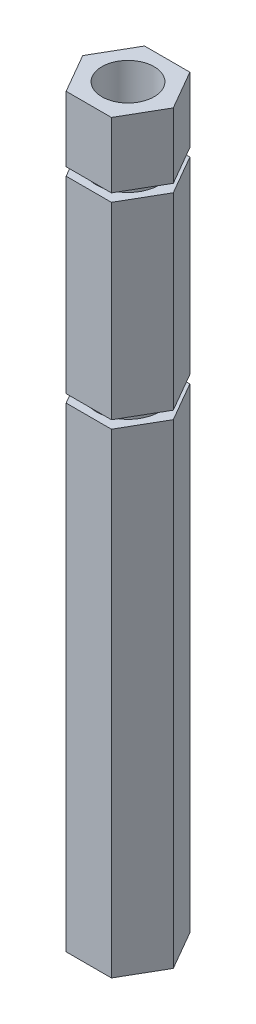
ISO-10303-21;
HEADER;
FILE_DESCRIPTION(('STEP AP214'),'2;1');
FILE_NAME('part.step','',(''),(''),'','','');
FILE_SCHEMA(('AUTOMOTIVE_DESIGN { 1 0 10303 214 1 1 1 1 }'));
ENDSEC;
DATA;
#1=APPLICATION_CONTEXT('core data for automotive mechanical design processes');
#2=APPLICATION_PROTOCOL_DEFINITION('international standard','automotive_design',2000,#1);
#3=PRODUCT_CONTEXT('',#1,'mechanical');
#4=PRODUCT('Part','Part','',(#3));
#5=PRODUCT_RELATED_PRODUCT_CATEGORY('part','',(#4));
#6=PRODUCT_DEFINITION_FORMATION('','',#4);
#7=PRODUCT_DEFINITION_CONTEXT('part definition',#1,'design');
#8=PRODUCT_DEFINITION('design','',#6,#7);
#9=PRODUCT_DEFINITION_SHAPE('','',#8);
#10=(LENGTH_UNIT() NAMED_UNIT(*) SI_UNIT(.MILLI.,.METRE.));
#11=(NAMED_UNIT(*) PLANE_ANGLE_UNIT() SI_UNIT($,.RADIAN.));
#12=(NAMED_UNIT(*) SI_UNIT($,.STERADIAN.) SOLID_ANGLE_UNIT());
#13=UNCERTAINTY_MEASURE_WITH_UNIT(LENGTH_MEASURE(1.E-05),#10,'distance_accuracy_value','');
#14=(GEOMETRIC_REPRESENTATION_CONTEXT(3) GLOBAL_UNCERTAINTY_ASSIGNED_CONTEXT((#13)) GLOBAL_UNIT_ASSIGNED_CONTEXT((#10,
#11,#12)) REPRESENTATION_CONTEXT('',''));
#15=CARTESIAN_POINT('',(0.,0.,0.));
#16=DIRECTION('',(0.,0.,1.));
#17=DIRECTION('',(1.,0.,0.));
#18=AXIS2_PLACEMENT_3D('',#15,#16,#17);
#19=CARTESIAN_POINT('',(0.,77.6732,0.));
#20=DIRECTION('',(0.,1.,0.));
#21=DIRECTION('',(0.,0.,1.));
#22=AXIS2_PLACEMENT_3D('',#19,#20,#21);
#23=PLANE('',#22);
#24=CARTESIAN_POINT('',(0.,77.6732,0.));
#25=DIRECTION('',(0.,1.,0.));
#26=DIRECTION('',(0.,0.,1.));
#27=AXIS2_PLACEMENT_3D('',#24,#25,#26);
#28=CIRCLE('',#27,3.16865);
#29=CARTESIAN_POINT('',(0.,77.6732,3.16865));
#30=VERTEX_POINT('',#29);
#31=EDGE_CURVE('E20',#30,#30,#28,.T.);
#32=ORIENTED_EDGE('',*,*,#31,.T.);
#33=EDGE_LOOP('',(#32));
#34=FACE_BOUND('',#33,.T.);
#35=ADVANCED_FACE('F17',(#34),#23,.T.);
#36=CARTESIAN_POINT('',(0.,77.6732,0.));
#37=DIRECTION('',(0.,1.,0.));
#38=DIRECTION('',(0.,0.,1.));
#39=AXIS2_PLACEMENT_3D('',#36,#37,#38);
#40=CYLINDRICAL_SURFACE('',#39,3.16865);
#41=CARTESIAN_POINT('',(0.,90.3732,0.));
#42=DIRECTION('',(0.,1.,0.));
#43=DIRECTION('',(0.,0.,1.));
#44=AXIS2_PLACEMENT_3D('',#41,#42,#43);
#45=CIRCLE('',#44,3.16865);
#46=CARTESIAN_POINT('',(0.,90.3732,3.16865));
#47=VERTEX_POINT('',#46);
#48=EDGE_CURVE('E154',#47,#47,#45,.F.);
#49=ORIENTED_EDGE('',*,*,#48,.F.);
#50=EDGE_LOOP('',(#49));
#51=FACE_BOUND('',#50,.T.);
#52=ORIENTED_EDGE('',*,*,#31,.F.);
#53=EDGE_LOOP('',(#52));
#54=FACE_BOUND('',#53,.T.);
#55=ADVANCED_FACE('F190',(#51,#54),#40,.F.);
#56=CARTESIAN_POINT('',(0.,90.3732,0.));
#57=DIRECTION('',(0.,1.,0.));
#58=DIRECTION('',(0.,0.,1.));
#59=AXIS2_PLACEMENT_3D('',#56,#57,#58);
#60=PLANE('',#59);
#61=DIRECTION('',(-0.500000000000007,0.,-0.866025403784435));
#62=VECTOR('',#61,1.);
#63=CARTESIAN_POINT('',(-5.49192896561248,90.3732,0.));
#64=LINE('',#63,#62);
#65=CARTESIAN_POINT('',(-5.49192896561248,90.3732,0.));
#66=VERTEX_POINT('',#65);
#67=CARTESIAN_POINT('',(-2.7459644828062,90.3732,4.75615000000003));
#68=VERTEX_POINT('',#67);
#69=EDGE_CURVE('E158',#66,#68,#64,.F.);
#70=ORIENTED_EDGE('',*,*,#69,.T.);
#71=DIRECTION('',(-1.,0.,0.));
#72=VECTOR('',#71,1.);
#73=CARTESIAN_POINT('',(-2.7459644828062,90.3732,4.75615000000003));
#74=LINE('',#73,#72);
#75=CARTESIAN_POINT('',(2.74596448280628,90.3732,4.75615));
#76=VERTEX_POINT('',#75);
#77=EDGE_CURVE('E139',#68,#76,#74,.F.);
#78=ORIENTED_EDGE('',*,*,#77,.T.);
#79=DIRECTION('',(-0.499999999999995,0.,0.866025403784442));
#80=VECTOR('',#79,1.);
#81=CARTESIAN_POINT('',(2.7459644828063,90.3732,4.75614999999997));
#82=LINE('',#81,#80);
#83=CARTESIAN_POINT('',(5.49192896561248,90.3732,0.));
#84=VERTEX_POINT('',#83);
#85=EDGE_CURVE('E145',#76,#84,#82,.F.);
#86=ORIENTED_EDGE('',*,*,#85,.T.);
#87=DIRECTION('',(0.500000000000001,0.,0.866025403784438));
#88=VECTOR('',#87,1.);
#89=CARTESIAN_POINT('',(5.49192896561248,90.3732,0.));
#90=LINE('',#89,#88);
#91=CARTESIAN_POINT('',(2.74596448280623,90.3732,-4.75615000000001));
#92=VERTEX_POINT('',#91);
#93=EDGE_CURVE('E486',#84,#92,#90,.F.);
#94=ORIENTED_EDGE('',*,*,#93,.T.);
#95=DIRECTION('',(1.,0.,0.));
#96=VECTOR('',#95,1.);
#97=CARTESIAN_POINT('',(2.74596448280623,90.3732,-4.75615000000001));
#98=LINE('',#97,#96);
#99=CARTESIAN_POINT('',(-2.74596448280626,90.3732,-4.75615));
#100=VERTEX_POINT('',#99);
#101=EDGE_CURVE('E479',#92,#100,#98,.F.);
#102=ORIENTED_EDGE('',*,*,#101,.T.);
#103=DIRECTION('',(0.499999999999995,0.,-0.866025403784442));
#104=VECTOR('',#103,1.);
#105=CARTESIAN_POINT('',(-2.74596448280626,90.3732,-4.75614999999999));
#106=LINE('',#105,#104);
#107=EDGE_CURVE('E473',#100,#66,#106,.F.);
#108=ORIENTED_EDGE('',*,*,#107,.T.);
#109=EDGE_LOOP('',(#70,#78,#86,#94,#102,#108));
#110=FACE_BOUND('',#109,.T.);
#111=ORIENTED_EDGE('',*,*,#48,.T.);
#112=EDGE_LOOP('',(#111));
#113=FACE_BOUND('',#112,.T.);
#114=ADVANCED_FACE('F161',(#110,#113),#60,.T.);
#115=CARTESIAN_POINT('',(2.7459644828063,90.3732,4.75614999999997));
#116=DIRECTION('',(-0.866025403784442,0.,-0.499999999999995));
#117=DIRECTION('',(-0.499999999999995,0.,0.866025403784442));
#118=AXIS2_PLACEMENT_3D('',#115,#116,#117);
#119=PLANE('',#118);
#120=DIRECTION('',(0.,1.,0.));
#121=VECTOR('',#120,1.);
#122=CARTESIAN_POINT('',(5.49192896561248,90.3732,0.));
#123=LINE('',#122,#121);
#124=CARTESIAN_POINT('',(5.49192896561248,82.4484,0.));
#125=VERTEX_POINT('',#124);
#126=EDGE_CURVE('E150',#125,#84,#123,.T.);
#127=ORIENTED_EDGE('',*,*,#126,.T.);
#128=ORIENTED_EDGE('',*,*,#85,.F.);
#129=DIRECTION('',(0.,1.,0.));
#130=VECTOR('',#129,1.);
#131=CARTESIAN_POINT('',(2.7459644828063,90.3732,4.75614999999997));
#132=LINE('',#131,#130);
#133=CARTESIAN_POINT('',(2.7459644828063,82.4484,4.75614999999997));
#134=VERTEX_POINT('',#133);
#135=EDGE_CURVE('E148',#76,#134,#132,.F.);
#136=ORIENTED_EDGE('',*,*,#135,.T.);
#137=DIRECTION('',(-0.499999999999995,0.,0.866025403784442));
#138=VECTOR('',#137,1.);
#139=CARTESIAN_POINT('',(5.49192896561248,82.4484,0.));
#140=LINE('',#139,#138);
#141=EDGE_CURVE('E491',#125,#134,#140,.T.);
#142=ORIENTED_EDGE('',*,*,#141,.F.);
#143=EDGE_LOOP('',(#127,#128,#136,#142));
#144=FACE_BOUND('',#143,.T.);
#145=ADVANCED_FACE('F146',(#144),#119,.F.);
#146=CARTESIAN_POINT('',(-2.7459644828062,90.3732,4.75615000000003));
#147=DIRECTION('',(0.,0.,-1.));
#148=DIRECTION('',(-1.,0.,0.));
#149=AXIS2_PLACEMENT_3D('',#146,#147,#148);
#150=PLANE('',#149);
#151=ORIENTED_EDGE('',*,*,#135,.F.);
#152=ORIENTED_EDGE('',*,*,#77,.F.);
#153=DIRECTION('',(0.,1.,0.));
#154=VECTOR('',#153,1.);
#155=CARTESIAN_POINT('',(-2.7459644828062,90.3732,4.75615000000003));
#156=LINE('',#155,#154);
#157=CARTESIAN_POINT('',(-2.7459644828062,82.4484,4.75615000000001));
#158=VERTEX_POINT('',#157);
#159=EDGE_CURVE('E469',#68,#158,#156,.F.);
#160=ORIENTED_EDGE('',*,*,#159,.T.);
#161=DIRECTION('',(1.,0.,0.));
#162=VECTOR('',#161,1.);
#163=CARTESIAN_POINT('',(3.8481,82.4484,4.75614999999997));
#164=LINE('',#163,#162);
#165=EDGE_CURVE('E157',#134,#158,#164,.F.);
#166=ORIENTED_EDGE('',*,*,#165,.F.);
#167=EDGE_LOOP('',(#151,#152,#160,#166));
#168=FACE_BOUND('',#167,.T.);
#169=ADVANCED_FACE('F156',(#168),#150,.F.);
#170=CARTESIAN_POINT('',(-5.49192896561248,90.3732,0.));
#171=DIRECTION('',(0.866025403784435,0.,-0.500000000000007));
#172=DIRECTION('',(-0.500000000000007,0.,-0.866025403784435));
#173=AXIS2_PLACEMENT_3D('',#170,#171,#172);
#174=PLANE('',#173);
#175=ORIENTED_EDGE('',*,*,#159,.F.);
#176=ORIENTED_EDGE('',*,*,#69,.F.);
#177=DIRECTION('',(0.,1.,0.));
#178=VECTOR('',#177,1.);
#179=CARTESIAN_POINT('',(-5.49192896561248,90.3732,0.));
#180=LINE('',#179,#178);
#181=CARTESIAN_POINT('',(-5.49192896561248,82.4484,0.));
#182=VERTEX_POINT('',#181);
#183=EDGE_CURVE('E475',#66,#182,#180,.F.);
#184=ORIENTED_EDGE('',*,*,#183,.T.);
#185=DIRECTION('',(-0.500000000000007,0.,-0.866025403784435));
#186=VECTOR('',#185,1.);
#187=CARTESIAN_POINT('',(-2.7459644828062,82.4484,4.75615000000003));
#188=LINE('',#187,#186);
#189=EDGE_CURVE('E472',#158,#182,#188,.T.);
#190=ORIENTED_EDGE('',*,*,#189,.F.);
#191=EDGE_LOOP('',(#175,#176,#184,#190));
#192=FACE_BOUND('',#191,.T.);
#193=ADVANCED_FACE('F289',(#192),#174,.F.);
#194=CARTESIAN_POINT('',(-2.74596448280626,90.3732,-4.75614999999999));
#195=DIRECTION('',(0.866025403784442,0.,0.499999999999995));
#196=DIRECTION('',(0.499999999999995,0.,-0.866025403784442));
#197=AXIS2_PLACEMENT_3D('',#194,#195,#196);
#198=PLANE('',#197);
#199=ORIENTED_EDGE('',*,*,#183,.F.);
#200=ORIENTED_EDGE('',*,*,#107,.F.);
#201=DIRECTION('',(0.,1.,0.));
#202=VECTOR('',#201,1.);
#203=CARTESIAN_POINT('',(-2.74596448280626,90.3732,-4.75614999999999));
#204=LINE('',#203,#202);
#205=CARTESIAN_POINT('',(-2.74596448280626,82.4484,-4.75614999999999));
#206=VERTEX_POINT('',#205);
#207=EDGE_CURVE('E482',#100,#206,#204,.F.);
#208=ORIENTED_EDGE('',*,*,#207,.T.);
#209=DIRECTION('',(0.499999999999995,0.,-0.866025403784441));
#210=VECTOR('',#209,1.);
#211=CARTESIAN_POINT('',(-5.49192896561248,82.4484,0.));
#212=LINE('',#211,#210);
#213=EDGE_CURVE('E495',#182,#206,#212,.T.);
#214=ORIENTED_EDGE('',*,*,#213,.F.);
#215=EDGE_LOOP('',(#199,#200,#208,#214));
#216=FACE_BOUND('',#215,.T.);
#217=ADVANCED_FACE('F285',(#216),#198,.F.);
#218=CARTESIAN_POINT('',(2.74596448280623,90.3732,-4.75615000000001));
#219=DIRECTION('',(0.,0.,1.));
#220=DIRECTION('',(1.,0.,0.));
#221=AXIS2_PLACEMENT_3D('',#218,#219,#220);
#222=PLANE('',#221);
#223=ORIENTED_EDGE('',*,*,#207,.F.);
#224=ORIENTED_EDGE('',*,*,#101,.F.);
#225=DIRECTION('',(0.,1.,0.));
#226=VECTOR('',#225,1.);
#227=CARTESIAN_POINT('',(2.74596448280623,90.3732,-4.75615000000001));
#228=LINE('',#227,#226);
#229=CARTESIAN_POINT('',(2.74596448280623,82.4484,-4.75615));
#230=VERTEX_POINT('',#229);
#231=EDGE_CURVE('E488',#92,#230,#228,.F.);
#232=ORIENTED_EDGE('',*,*,#231,.T.);
#233=DIRECTION('',(1.,0.,0.));
#234=VECTOR('',#233,1.);
#235=CARTESIAN_POINT('',(3.8481,82.4484,-4.75614999999999));
#236=LINE('',#235,#234);
#237=EDGE_CURVE('E497',#206,#230,#236,.T.);
#238=ORIENTED_EDGE('',*,*,#237,.F.);
#239=EDGE_LOOP('',(#223,#224,#232,#238));
#240=FACE_BOUND('',#239,.T.);
#241=ADVANCED_FACE('F281',(#240),#222,.F.);
#242=CARTESIAN_POINT('',(5.49192896561248,90.3732,0.));
#243=DIRECTION('',(-0.866025403784438,0.,0.500000000000001));
#244=DIRECTION('',(0.500000000000001,0.,0.866025403784438));
#245=AXIS2_PLACEMENT_3D('',#242,#243,#244);
#246=PLANE('',#245);
#247=ORIENTED_EDGE('',*,*,#231,.F.);
#248=ORIENTED_EDGE('',*,*,#93,.F.);
#249=ORIENTED_EDGE('',*,*,#126,.F.);
#250=DIRECTION('',(0.500000000000001,0.,0.866025403784438));
#251=VECTOR('',#250,1.);
#252=CARTESIAN_POINT('',(2.74596448280623,82.4484,-4.75615000000001));
#253=LINE('',#252,#251);
#254=EDGE_CURVE('E183',#230,#125,#253,.T.);
#255=ORIENTED_EDGE('',*,*,#254,.F.);
#256=EDGE_LOOP('',(#247,#248,#249,#255));
#257=FACE_BOUND('',#256,.T.);
#258=ADVANCED_FACE('F277',(#257),#246,.F.);
#259=CARTESIAN_POINT('',(3.8481,82.4484,0.));
#260=DIRECTION('',(0.,-1.,0.));
#261=DIRECTION('',(0.,0.,-1.));
#262=AXIS2_PLACEMENT_3D('',#259,#260,#261);
#263=PLANE('',#262);
#264=ORIENTED_EDGE('',*,*,#237,.T.);
#265=ORIENTED_EDGE('',*,*,#254,.T.);
#266=ORIENTED_EDGE('',*,*,#141,.T.);
#267=ORIENTED_EDGE('',*,*,#165,.T.);
#268=ORIENTED_EDGE('',*,*,#189,.T.);
#269=ORIENTED_EDGE('',*,*,#213,.T.);
#270=EDGE_LOOP('',(#264,#265,#266,#267,#268,#269));
#271=FACE_BOUND('',#270,.T.);
#272=CARTESIAN_POINT('',(0.,82.4484,0.));
#273=DIRECTION('',(0.,1.,0.));
#274=DIRECTION('',(0.,0.,1.));
#275=AXIS2_PLACEMENT_3D('',#272,#273,#274);
#276=CIRCLE('',#275,3.8481);
#277=CARTESIAN_POINT('',(0.,82.4484,3.8481));
#278=VERTEX_POINT('',#277);
#279=EDGE_CURVE('E181',#278,#278,#276,.F.);
#280=ORIENTED_EDGE('',*,*,#279,.F.);
#281=EDGE_LOOP('',(#280));
#282=FACE_BOUND('',#281,.T.);
#283=ADVANCED_FACE('F273',(#271,#282),#263,.T.);
#284=CARTESIAN_POINT('',(0.,88.5049982362318,0.));
#285=DIRECTION('',(0.,1.,0.));
#286=DIRECTION('',(0.,0.,1.));
#287=AXIS2_PLACEMENT_3D('',#284,#285,#286);
#288=CYLINDRICAL_SURFACE('',#287,3.8481);
#289=CARTESIAN_POINT('',(0.,81.4578,0.));
#290=DIRECTION('',(0.,1.,0.));
#291=DIRECTION('',(0.,0.,1.));
#292=AXIS2_PLACEMENT_3D('',#289,#290,#291);
#293=CIRCLE('',#292,3.8481);
#294=CARTESIAN_POINT('',(0.,81.4578,3.8481));
#295=VERTEX_POINT('',#294);
#296=EDGE_CURVE('E177',#295,#295,#293,.F.);
#297=ORIENTED_EDGE('',*,*,#296,.F.);
#298=EDGE_LOOP('',(#297));
#299=FACE_BOUND('',#298,.T.);
#300=ORIENTED_EDGE('',*,*,#279,.T.);
#301=EDGE_LOOP('',(#300));
#302=FACE_BOUND('',#301,.T.);
#303=ADVANCED_FACE('F269',(#299,#302),#288,.T.);
#304=CARTESIAN_POINT('',(3.8481,81.4578,0.));
#305=DIRECTION('',(0.,1.,0.));
#306=DIRECTION('',(0.,0.,1.));
#307=AXIS2_PLACEMENT_3D('',#304,#305,#306);
#308=PLANE('',#307);
#309=DIRECTION('',(-0.500000000000007,0.,-0.866025403784435));
#310=VECTOR('',#309,1.);
#311=CARTESIAN_POINT('',(-5.49192896561248,81.4578,0.));
#312=LINE('',#311,#310);
#313=CARTESIAN_POINT('',(-5.49192896561248,81.4578,0.));
#314=VERTEX_POINT('',#313);
#315=CARTESIAN_POINT('',(-2.7459644828062,81.4578,4.75615000000003));
#316=VERTEX_POINT('',#315);
#317=EDGE_CURVE('E511',#314,#316,#312,.F.);
#318=ORIENTED_EDGE('',*,*,#317,.T.);
#319=DIRECTION('',(-1.,0.,0.));
#320=VECTOR('',#319,1.);
#321=CARTESIAN_POINT('',(-2.7459644828062,81.4578,4.75615000000003));
#322=LINE('',#321,#320);
#323=CARTESIAN_POINT('',(2.74596448280629,81.4578,4.75614999999998));
#324=VERTEX_POINT('',#323);
#325=EDGE_CURVE('E505',#316,#324,#322,.F.);
#326=ORIENTED_EDGE('',*,*,#325,.T.);
#327=DIRECTION('',(-0.499999999999995,0.,0.866025403784442));
#328=VECTOR('',#327,1.);
#329=CARTESIAN_POINT('',(2.7459644828063,81.4578,4.75614999999997));
#330=LINE('',#329,#328);
#331=CARTESIAN_POINT('',(5.49192896561248,81.4578,0.));
#332=VERTEX_POINT('',#331);
#333=EDGE_CURVE('E180',#324,#332,#330,.F.);
#334=ORIENTED_EDGE('',*,*,#333,.T.);
#335=DIRECTION('',(0.500000000000001,0.,0.866025403784438));
#336=VECTOR('',#335,1.);
#337=CARTESIAN_POINT('',(5.49192896561248,81.4578,0.));
#338=LINE('',#337,#336);
#339=CARTESIAN_POINT('',(2.74596448280623,81.4578,-4.75615000000001));
#340=VERTEX_POINT('',#339);
#341=EDGE_CURVE('E532',#332,#340,#338,.F.);
#342=ORIENTED_EDGE('',*,*,#341,.T.);
#343=DIRECTION('',(1.,0.,0.));
#344=VECTOR('',#343,1.);
#345=CARTESIAN_POINT('',(2.74596448280623,81.4578,-4.75615000000001));
#346=LINE('',#345,#344);
#347=CARTESIAN_POINT('',(-2.74596448280626,81.4578,-4.75615));
#348=VERTEX_POINT('',#347);
#349=EDGE_CURVE('E523',#340,#348,#346,.F.);
#350=ORIENTED_EDGE('',*,*,#349,.T.);
#351=DIRECTION('',(0.499999999999995,0.,-0.866025403784442));
#352=VECTOR('',#351,1.);
#353=CARTESIAN_POINT('',(-2.74596448280626,81.4578,-4.75614999999999));
#354=LINE('',#353,#352);
#355=EDGE_CURVE('E517',#348,#314,#354,.F.);
#356=ORIENTED_EDGE('',*,*,#355,.T.);
#357=EDGE_LOOP('',(#318,#326,#334,#342,#350,#356));
#358=FACE_BOUND('',#357,.T.);
#359=ORIENTED_EDGE('',*,*,#296,.T.);
#360=EDGE_LOOP('',(#359));
#361=FACE_BOUND('',#360,.T.);
#362=ADVANCED_FACE('F265',(#358,#361),#308,.T.);
#363=CARTESIAN_POINT('',(2.7459644828063,90.3732,4.75614999999997));
#364=DIRECTION('',(-0.866025403784442,0.,-0.499999999999995));
#365=DIRECTION('',(-0.499999999999995,0.,0.866025403784442));
#366=AXIS2_PLACEMENT_3D('',#363,#364,#365);
#367=PLANE('',#366);
#368=DIRECTION('',(0.,1.,0.));
#369=VECTOR('',#368,1.);
#370=CARTESIAN_POINT('',(2.7459644828063,90.3732,4.75614999999997));
#371=LINE('',#370,#369);
#372=CARTESIAN_POINT('',(2.7459644828063,58.6232,4.75614999999997));
#373=VERTEX_POINT('',#372);
#374=EDGE_CURVE('E502',#324,#373,#371,.F.);
#375=ORIENTED_EDGE('',*,*,#374,.T.);
#376=DIRECTION('',(-0.499999999999995,0.,0.866025403784442));
#377=VECTOR('',#376,1.);
#378=CARTESIAN_POINT('',(5.49192896561248,58.6232,0.));
#379=LINE('',#378,#377);
#380=CARTESIAN_POINT('',(5.49192896561248,58.6232,0.));
#381=VERTEX_POINT('',#380);
#382=EDGE_CURVE('E535',#381,#373,#379,.T.);
#383=ORIENTED_EDGE('',*,*,#382,.F.);
#384=DIRECTION('',(0.,1.,0.));
#385=VECTOR('',#384,1.);
#386=CARTESIAN_POINT('',(5.49192896561248,90.3732,0.));
#387=LINE('',#386,#385);
#388=EDGE_CURVE('E529',#381,#332,#387,.T.);
#389=ORIENTED_EDGE('',*,*,#388,.T.);
#390=ORIENTED_EDGE('',*,*,#333,.F.);
#391=EDGE_LOOP('',(#375,#383,#389,#390));
#392=FACE_BOUND('',#391,.T.);
#393=ADVANCED_FACE('F261',(#392),#367,.F.);
#394=CARTESIAN_POINT('',(-2.7459644828062,90.3732,4.75615000000003));
#395=DIRECTION('',(0.,0.,-1.));
#396=DIRECTION('',(-1.,0.,0.));
#397=AXIS2_PLACEMENT_3D('',#394,#395,#396);
#398=PLANE('',#397);
#399=DIRECTION('',(0.,1.,0.));
#400=VECTOR('',#399,1.);
#401=CARTESIAN_POINT('',(-2.7459644828062,90.3732,4.75615000000003));
#402=LINE('',#401,#400);
#403=CARTESIAN_POINT('',(-2.7459644828062,58.6232,4.75615000000001));
#404=VERTEX_POINT('',#403);
#405=EDGE_CURVE('E508',#316,#404,#402,.F.);
#406=ORIENTED_EDGE('',*,*,#405,.T.);
#407=DIRECTION('',(1.,0.,0.));
#408=VECTOR('',#407,1.);
#409=CARTESIAN_POINT('',(3.8481,58.6232,4.75614999999997));
#410=LINE('',#409,#408);
#411=EDGE_CURVE('E537',#373,#404,#410,.F.);
#412=ORIENTED_EDGE('',*,*,#411,.F.);
#413=ORIENTED_EDGE('',*,*,#374,.F.);
#414=ORIENTED_EDGE('',*,*,#325,.F.);
#415=EDGE_LOOP('',(#406,#412,#413,#414));
#416=FACE_BOUND('',#415,.T.);
#417=ADVANCED_FACE('F257',(#416),#398,.F.);
#418=CARTESIAN_POINT('',(-5.49192896561248,90.3732,0.));
#419=DIRECTION('',(0.866025403784435,0.,-0.500000000000007));
#420=DIRECTION('',(-0.500000000000007,0.,-0.866025403784435));
#421=AXIS2_PLACEMENT_3D('',#418,#419,#420);
#422=PLANE('',#421);
#423=DIRECTION('',(0.,1.,0.));
#424=VECTOR('',#423,1.);
#425=CARTESIAN_POINT('',(-5.49192896561248,90.3732,0.));
#426=LINE('',#425,#424);
#427=CARTESIAN_POINT('',(-5.49192896561248,58.6232,0.));
#428=VERTEX_POINT('',#427);
#429=EDGE_CURVE('E514',#314,#428,#426,.F.);
#430=ORIENTED_EDGE('',*,*,#429,.T.);
#431=DIRECTION('',(-0.500000000000007,0.,-0.866025403784435));
#432=VECTOR('',#431,1.);
#433=CARTESIAN_POINT('',(-2.7459644828062,58.6232,4.75615000000003));
#434=LINE('',#433,#432);
#435=EDGE_CURVE('E539',#404,#428,#434,.T.);
#436=ORIENTED_EDGE('',*,*,#435,.F.);
#437=ORIENTED_EDGE('',*,*,#405,.F.);
#438=ORIENTED_EDGE('',*,*,#317,.F.);
#439=EDGE_LOOP('',(#430,#436,#437,#438));
#440=FACE_BOUND('',#439,.T.);
#441=ADVANCED_FACE('F253',(#440),#422,.F.);
#442=CARTESIAN_POINT('',(-2.74596448280626,90.3732,-4.75614999999999));
#443=DIRECTION('',(0.866025403784442,0.,0.499999999999995));
#444=DIRECTION('',(0.499999999999995,0.,-0.866025403784442));
#445=AXIS2_PLACEMENT_3D('',#442,#443,#444);
#446=PLANE('',#445);
#447=DIRECTION('',(0.,1.,0.));
#448=VECTOR('',#447,1.);
#449=CARTESIAN_POINT('',(-2.74596448280626,90.3732,-4.75614999999999));
#450=LINE('',#449,#448);
#451=CARTESIAN_POINT('',(-2.74596448280626,58.6232,-4.75614999999999));
#452=VERTEX_POINT('',#451);
#453=EDGE_CURVE('E520',#348,#452,#450,.F.);
#454=ORIENTED_EDGE('',*,*,#453,.T.);
#455=DIRECTION('',(0.499999999999995,0.,-0.866025403784442));
#456=VECTOR('',#455,1.);
#457=CARTESIAN_POINT('',(-5.49192896561248,58.6232,0.));
#458=LINE('',#457,#456);
#459=EDGE_CURVE('E541',#428,#452,#458,.T.);
#460=ORIENTED_EDGE('',*,*,#459,.F.);
#461=ORIENTED_EDGE('',*,*,#429,.F.);
#462=ORIENTED_EDGE('',*,*,#355,.F.);
#463=EDGE_LOOP('',(#454,#460,#461,#462));
#464=FACE_BOUND('',#463,.T.);
#465=ADVANCED_FACE('F249',(#464),#446,.F.);
#466=CARTESIAN_POINT('',(2.74596448280623,90.3732,-4.75615000000001));
#467=DIRECTION('',(0.,0.,1.));
#468=DIRECTION('',(1.,0.,0.));
#469=AXIS2_PLACEMENT_3D('',#466,#467,#468);
#470=PLANE('',#469);
#471=DIRECTION('',(0.,1.,0.));
#472=VECTOR('',#471,1.);
#473=CARTESIAN_POINT('',(2.74596448280623,90.3732,-4.75615000000001));
#474=LINE('',#473,#472);
#475=CARTESIAN_POINT('',(2.74596448280623,58.6232,-4.75615));
#476=VERTEX_POINT('',#475);
#477=EDGE_CURVE('E526',#340,#476,#474,.F.);
#478=ORIENTED_EDGE('',*,*,#477,.T.);
#479=DIRECTION('',(1.,0.,0.));
#480=VECTOR('',#479,1.);
#481=CARTESIAN_POINT('',(3.8481,58.6232,-4.75614999999999));
#482=LINE('',#481,#480);
#483=EDGE_CURVE('E543',#452,#476,#482,.T.);
#484=ORIENTED_EDGE('',*,*,#483,.F.);
#485=ORIENTED_EDGE('',*,*,#453,.F.);
#486=ORIENTED_EDGE('',*,*,#349,.F.);
#487=EDGE_LOOP('',(#478,#484,#485,#486));
#488=FACE_BOUND('',#487,.T.);
#489=ADVANCED_FACE('F245',(#488),#470,.F.);
#490=CARTESIAN_POINT('',(5.49192896561248,90.3732,0.));
#491=DIRECTION('',(-0.866025403784438,0.,0.500000000000001));
#492=DIRECTION('',(0.500000000000001,0.,0.866025403784438));
#493=AXIS2_PLACEMENT_3D('',#490,#491,#492);
#494=PLANE('',#493);
#495=ORIENTED_EDGE('',*,*,#388,.F.);
#496=DIRECTION('',(0.500000000000001,0.,0.866025403784438));
#497=VECTOR('',#496,1.);
#498=CARTESIAN_POINT('',(2.74596448280623,58.6232,-4.75615000000001));
#499=LINE('',#498,#497);
#500=EDGE_CURVE('E176',#476,#381,#499,.T.);
#501=ORIENTED_EDGE('',*,*,#500,.F.);
#502=ORIENTED_EDGE('',*,*,#477,.F.);
#503=ORIENTED_EDGE('',*,*,#341,.F.);
#504=EDGE_LOOP('',(#495,#501,#502,#503));
#505=FACE_BOUND('',#504,.T.);
#506=ADVANCED_FACE('F241',(#505),#494,.F.);
#507=CARTESIAN_POINT('',(3.8481,58.6232,0.));
#508=DIRECTION('',(0.,-1.,0.));
#509=DIRECTION('',(0.,0.,-1.));
#510=AXIS2_PLACEMENT_3D('',#507,#508,#509);
#511=PLANE('',#510);
#512=ORIENTED_EDGE('',*,*,#483,.T.);
#513=ORIENTED_EDGE('',*,*,#500,.T.);
#514=ORIENTED_EDGE('',*,*,#382,.T.);
#515=ORIENTED_EDGE('',*,*,#411,.T.);
#516=ORIENTED_EDGE('',*,*,#435,.T.);
#517=ORIENTED_EDGE('',*,*,#459,.T.);
#518=EDGE_LOOP('',(#512,#513,#514,#515,#516,#517));
#519=FACE_BOUND('',#518,.T.);
#520=CARTESIAN_POINT('',(0.,58.6232,0.));
#521=DIRECTION('',(0.,1.,0.));
#522=DIRECTION('',(0.,0.,1.));
#523=AXIS2_PLACEMENT_3D('',#520,#521,#522);
#524=CIRCLE('',#523,3.8481);
#525=CARTESIAN_POINT('',(0.,58.6232,3.8481));
#526=VERTEX_POINT('',#525);
#527=EDGE_CURVE('E172',#526,#526,#524,.F.);
#528=ORIENTED_EDGE('',*,*,#527,.F.);
#529=EDGE_LOOP('',(#528));
#530=FACE_BOUND('',#529,.T.);
#531=ADVANCED_FACE('F237',(#519,#530),#511,.T.);
#532=CARTESIAN_POINT('',(0.,88.5049982362318,0.));
#533=DIRECTION('',(0.,1.,0.));
#534=DIRECTION('',(0.,0.,1.));
#535=AXIS2_PLACEMENT_3D('',#532,#533,#534);
#536=CYLINDRICAL_SURFACE('',#535,3.8481);
#537=CARTESIAN_POINT('',(0.,57.6326,0.));
#538=DIRECTION('',(0.,1.,0.));
#539=DIRECTION('',(0.,0.,1.));
#540=AXIS2_PLACEMENT_3D('',#537,#538,#539);
#541=CIRCLE('',#540,3.8481);
#542=CARTESIAN_POINT('',(0.,57.6326,3.8481));
#543=VERTEX_POINT('',#542);
#544=EDGE_CURVE('E167',#543,#543,#541,.F.);
#545=ORIENTED_EDGE('',*,*,#544,.F.);
#546=EDGE_LOOP('',(#545));
#547=FACE_BOUND('',#546,.T.);
#548=ORIENTED_EDGE('',*,*,#527,.T.);
#549=EDGE_LOOP('',(#548));
#550=FACE_BOUND('',#549,.T.);
#551=ADVANCED_FACE('F233',(#547,#550),#536,.T.);
#552=CARTESIAN_POINT('',(5.49192896561248,90.3732,0.));
#553=DIRECTION('',(-0.866025403784438,0.,0.500000000000001));
#554=DIRECTION('',(0.500000000000001,0.,0.866025403784438));
#555=AXIS2_PLACEMENT_3D('',#552,#553,#554);
#556=PLANE('',#555);
#557=DIRECTION('',(0.,1.,0.));
#558=VECTOR('',#557,1.);
#559=CARTESIAN_POINT('',(5.49192896561248,90.3732,0.));
#560=LINE('',#559,#558);
#561=CARTESIAN_POINT('',(5.49192896561248,57.6326,0.));
#562=VERTEX_POINT('',#561);
#563=CARTESIAN_POINT('',(5.49192896561248,0.,0.));
#564=VERTEX_POINT('',#563);
#565=EDGE_CURVE('E552',#562,#564,#560,.F.);
#566=ORIENTED_EDGE('',*,*,#565,.T.);
#567=DIRECTION('',(-0.500000000000001,0.,-0.866025403784438));
#568=VECTOR('',#567,1.);
#569=CARTESIAN_POINT('',(5.49192896561248,0.,0.));
#570=LINE('',#569,#568);
#571=CARTESIAN_POINT('',(2.74596448280623,0.,-4.75615000000001));
#572=VERTEX_POINT('',#571);
#573=EDGE_CURVE('E555',#564,#572,#570,.T.);
#574=ORIENTED_EDGE('',*,*,#573,.T.);
#575=DIRECTION('',(0.,1.,0.));
#576=VECTOR('',#575,1.);
#577=CARTESIAN_POINT('',(2.74596448280623,90.3732,-4.75615000000001));
#578=LINE('',#577,#576);
#579=CARTESIAN_POINT('',(2.74596448280623,57.6326,-4.75615000000001));
#580=VERTEX_POINT('',#579);
#581=EDGE_CURVE('E175',#572,#580,#578,.T.);
#582=ORIENTED_EDGE('',*,*,#581,.T.);
#583=DIRECTION('',(-0.500000000000001,0.,-0.866025403784438));
#584=VECTOR('',#583,1.);
#585=CARTESIAN_POINT('',(5.49192896561248,57.6326,0.));
#586=LINE('',#585,#584);
#587=EDGE_CURVE('E573',#562,#580,#586,.T.);
#588=ORIENTED_EDGE('',*,*,#587,.F.);
#589=EDGE_LOOP('',(#566,#574,#582,#588));
#590=FACE_BOUND('',#589,.T.);
#591=ADVANCED_FACE('F229',(#590),#556,.F.);
#592=CARTESIAN_POINT('',(2.74596448280623,90.3732,-4.75615000000001));
#593=DIRECTION('',(0.,0.,1.));
#594=DIRECTION('',(1.,0.,0.));
#595=AXIS2_PLACEMENT_3D('',#592,#593,#594);
#596=PLANE('',#595);
#597=ORIENTED_EDGE('',*,*,#581,.F.);
#598=DIRECTION('',(1.,0.,0.));
#599=VECTOR('',#598,1.);
#600=CARTESIAN_POINT('',(0.,0.,-4.75615000000001));
#601=LINE('',#600,#599);
#602=CARTESIAN_POINT('',(-2.74596448280626,0.,-4.75615));
#603=VERTEX_POINT('',#602);
#604=EDGE_CURVE('E558',#572,#603,#601,.F.);
#605=ORIENTED_EDGE('',*,*,#604,.T.);
#606=DIRECTION('',(0.,1.,0.));
#607=VECTOR('',#606,1.);
#608=CARTESIAN_POINT('',(-2.74596448280626,90.3732,-4.75614999999999));
#609=LINE('',#608,#607);
#610=CARTESIAN_POINT('',(-2.74596448280626,57.6326,-4.75615));
#611=VERTEX_POINT('',#610);
#612=EDGE_CURVE('E549',#603,#611,#609,.T.);
#613=ORIENTED_EDGE('',*,*,#612,.T.);
#614=DIRECTION('',(1.,0.,0.));
#615=VECTOR('',#614,1.);
#616=CARTESIAN_POINT('',(3.8481,57.6326,-4.75615000000001));
#617=LINE('',#616,#615);
#618=EDGE_CURVE('E575',#580,#611,#617,.F.);
#619=ORIENTED_EDGE('',*,*,#618,.F.);
#620=EDGE_LOOP('',(#597,#605,#613,#619));
#621=FACE_BOUND('',#620,.T.);
#622=ADVANCED_FACE('F225',(#621),#596,.F.);
#623=CARTESIAN_POINT('',(-2.74596448280626,90.3732,-4.75614999999999));
#624=DIRECTION('',(0.866025403784442,0.,0.499999999999995));
#625=DIRECTION('',(0.499999999999995,0.,-0.866025403784442));
#626=AXIS2_PLACEMENT_3D('',#623,#624,#625);
#627=PLANE('',#626);
#628=ORIENTED_EDGE('',*,*,#612,.F.);
#629=DIRECTION('',(-0.499999999999995,0.,0.866025403784442));
#630=VECTOR('',#629,1.);
#631=CARTESIAN_POINT('',(-2.74596448280626,0.,-4.75614999999999));
#632=LINE('',#631,#630);
#633=CARTESIAN_POINT('',(-5.49192896561248,0.,0.));
#634=VERTEX_POINT('',#633);
#635=EDGE_CURVE('E561',#603,#634,#632,.T.);
#636=ORIENTED_EDGE('',*,*,#635,.T.);
#637=DIRECTION('',(0.,1.,0.));
#638=VECTOR('',#637,1.);
#639=CARTESIAN_POINT('',(-5.49192896561248,90.3732,0.));
#640=LINE('',#639,#638);
#641=CARTESIAN_POINT('',(-5.49192896561248,57.6326,0.));
#642=VERTEX_POINT('',#641);
#643=EDGE_CURVE('E171',#634,#642,#640,.T.);
#644=ORIENTED_EDGE('',*,*,#643,.T.);
#645=DIRECTION('',(-0.499999999999995,0.,0.866025403784442));
#646=VECTOR('',#645,1.);
#647=CARTESIAN_POINT('',(-2.74596448280626,57.6326,-4.75614999999999));
#648=LINE('',#647,#646);
#649=EDGE_CURVE('E577',#611,#642,#648,.T.);
#650=ORIENTED_EDGE('',*,*,#649,.F.);
#651=EDGE_LOOP('',(#628,#636,#644,#650));
#652=FACE_BOUND('',#651,.T.);
#653=ADVANCED_FACE('F221',(#652),#627,.F.);
#654=CARTESIAN_POINT('',(2.7459644828063,90.3732,4.75614999999997));
#655=DIRECTION('',(-0.866025403784442,0.,-0.499999999999995));
#656=DIRECTION('',(-0.499999999999995,0.,0.866025403784442));
#657=AXIS2_PLACEMENT_3D('',#654,#655,#656);
#658=PLANE('',#657);
#659=DIRECTION('',(0.,1.,0.));
#660=VECTOR('',#659,1.);
#661=CARTESIAN_POINT('',(2.7459644828063,90.3732,4.75614999999997));
#662=LINE('',#661,#660);
#663=CARTESIAN_POINT('',(2.74596448280629,57.6326,4.75614999999998));
#664=VERTEX_POINT('',#663);
#665=CARTESIAN_POINT('',(2.74596448280629,0.,4.75614999999998));
#666=VERTEX_POINT('',#665);
#667=EDGE_CURVE('E580',#664,#666,#662,.F.);
#668=ORIENTED_EDGE('',*,*,#667,.T.);
#669=DIRECTION('',(0.499999999999995,0.,-0.866025403784442));
#670=VECTOR('',#669,1.);
#671=CARTESIAN_POINT('',(2.7459644828063,0.,4.75614999999997));
#672=LINE('',#671,#670);
#673=EDGE_CURVE('E563',#666,#564,#672,.T.);
#674=ORIENTED_EDGE('',*,*,#673,.T.);
#675=ORIENTED_EDGE('',*,*,#565,.F.);
#676=DIRECTION('',(0.499999999999995,0.,-0.866025403784442));
#677=VECTOR('',#676,1.);
#678=CARTESIAN_POINT('',(2.7459644828063,57.6326,4.75614999999997));
#679=LINE('',#678,#677);
#680=EDGE_CURVE('E170',#664,#562,#679,.T.);
#681=ORIENTED_EDGE('',*,*,#680,.F.);
#682=EDGE_LOOP('',(#668,#674,#675,#681));
#683=FACE_BOUND('',#682,.T.);
#684=ADVANCED_FACE('F217',(#683),#658,.F.);
#685=CARTESIAN_POINT('',(0.,0.,0.));
#686=DIRECTION('',(0.,1.,0.));
#687=DIRECTION('',(0.,0.,1.));
#688=AXIS2_PLACEMENT_3D('',#685,#686,#687);
#689=PLANE('',#688);
#690=DIRECTION('',(-1.,0.,0.));
#691=VECTOR('',#690,1.);
#692=CARTESIAN_POINT('',(-2.7459644828062,0.,4.75615000000003));
#693=LINE('',#692,#691);
#694=CARTESIAN_POINT('',(-2.7459644828062,0.,4.75615000000003));
#695=VERTEX_POINT('',#694);
#696=EDGE_CURVE('E583',#666,#695,#693,.T.);
#697=ORIENTED_EDGE('',*,*,#696,.T.);
#698=DIRECTION('',(-0.500000000000007,0.,-0.866025403784435));
#699=VECTOR('',#698,1.);
#700=CARTESIAN_POINT('',(-5.49192896561248,0.,0.));
#701=LINE('',#700,#699);
#702=EDGE_CURVE('E566',#695,#634,#701,.T.);
#703=ORIENTED_EDGE('',*,*,#702,.T.);
#704=ORIENTED_EDGE('',*,*,#635,.F.);
#705=ORIENTED_EDGE('',*,*,#604,.F.);
#706=ORIENTED_EDGE('',*,*,#573,.F.);
#707=ORIENTED_EDGE('',*,*,#673,.F.);
#708=EDGE_LOOP('',(#697,#703,#704,#705,#706,#707));
#709=FACE_BOUND('',#708,.T.);
#710=ADVANCED_FACE('F213',(#709),#689,.F.);
#711=CARTESIAN_POINT('',(-5.49192896561248,90.3732,0.));
#712=DIRECTION('',(0.866025403784435,0.,-0.500000000000007));
#713=DIRECTION('',(-0.500000000000007,0.,-0.866025403784435));
#714=AXIS2_PLACEMENT_3D('',#711,#712,#713);
#715=PLANE('',#714);
#716=ORIENTED_EDGE('',*,*,#643,.F.);
#717=ORIENTED_EDGE('',*,*,#702,.F.);
#718=DIRECTION('',(0.,1.,0.));
#719=VECTOR('',#718,1.);
#720=CARTESIAN_POINT('',(-2.7459644828062,90.3732,4.75615000000003));
#721=LINE('',#720,#719);
#722=CARTESIAN_POINT('',(-2.7459644828062,57.6326,4.75615000000003));
#723=VERTEX_POINT('',#722);
#724=EDGE_CURVE('E26',#695,#723,#721,.T.);
#725=ORIENTED_EDGE('',*,*,#724,.T.);
#726=DIRECTION('',(0.500000000000007,0.,0.866025403784435));
#727=VECTOR('',#726,1.);
#728=CARTESIAN_POINT('',(-5.49192896561248,57.6326,0.));
#729=LINE('',#728,#727);
#730=EDGE_CURVE('E34',#642,#723,#729,.T.);
#731=ORIENTED_EDGE('',*,*,#730,.F.);
#732=EDGE_LOOP('',(#716,#717,#725,#731));
#733=FACE_BOUND('',#732,.T.);
#734=ADVANCED_FACE('F207',(#733),#715,.F.);
#735=CARTESIAN_POINT('',(3.8481,57.6326,0.));
#736=DIRECTION('',(0.,1.,0.));
#737=DIRECTION('',(0.,0.,1.));
#738=AXIS2_PLACEMENT_3D('',#735,#736,#737);
#739=PLANE('',#738);
#740=ORIENTED_EDGE('',*,*,#730,.T.);
#741=DIRECTION('',(-1.,0.,0.));
#742=VECTOR('',#741,1.);
#743=CARTESIAN_POINT('',(-2.7459644828062,57.6326,4.75615000000003));
#744=LINE('',#743,#742);
#745=EDGE_CURVE('E11',#723,#664,#744,.F.);
#746=ORIENTED_EDGE('',*,*,#745,.T.);
#747=ORIENTED_EDGE('',*,*,#680,.T.);
#748=ORIENTED_EDGE('',*,*,#587,.T.);
#749=ORIENTED_EDGE('',*,*,#618,.T.);
#750=ORIENTED_EDGE('',*,*,#649,.T.);
#751=EDGE_LOOP('',(#740,#746,#747,#748,#749,#750));
#752=FACE_BOUND('',#751,.T.);
#753=ORIENTED_EDGE('',*,*,#544,.T.);
#754=EDGE_LOOP('',(#753));
#755=FACE_BOUND('',#754,.T.);
#756=ADVANCED_FACE('F201',(#752,#755),#739,.T.);
#757=CARTESIAN_POINT('',(-2.7459644828062,90.3732,4.75615000000003));
#758=DIRECTION('',(0.,0.,-1.));
#759=DIRECTION('',(-1.,0.,0.));
#760=AXIS2_PLACEMENT_3D('',#757,#758,#759);
#761=PLANE('',#760);
#762=ORIENTED_EDGE('',*,*,#724,.F.);
#763=ORIENTED_EDGE('',*,*,#696,.F.);
#764=ORIENTED_EDGE('',*,*,#667,.F.);
#765=ORIENTED_EDGE('',*,*,#745,.F.);
#766=EDGE_LOOP('',(#762,#763,#764,#765));
#767=FACE_BOUND('',#766,.T.);
#768=ADVANCED_FACE('F199',(#767),#761,.F.);
#769=CLOSED_SHELL('',(#35,#55,#114,#145,#169,#193,#217,#241,#258,#283,#303,#362,#393,#417,#441,
#465,#489,#506,#531,#551,#591,#622,#653,#684,#710,#734,#756,#768));
#770=MANIFOLD_SOLID_BREP('B1',#769);
#771=ADVANCED_BREP_SHAPE_REPRESENTATION('',(#18,#770),#14);
#772=SHAPE_DEFINITION_REPRESENTATION(#9,#771);
ENDSEC;
END-ISO-10303-21;
